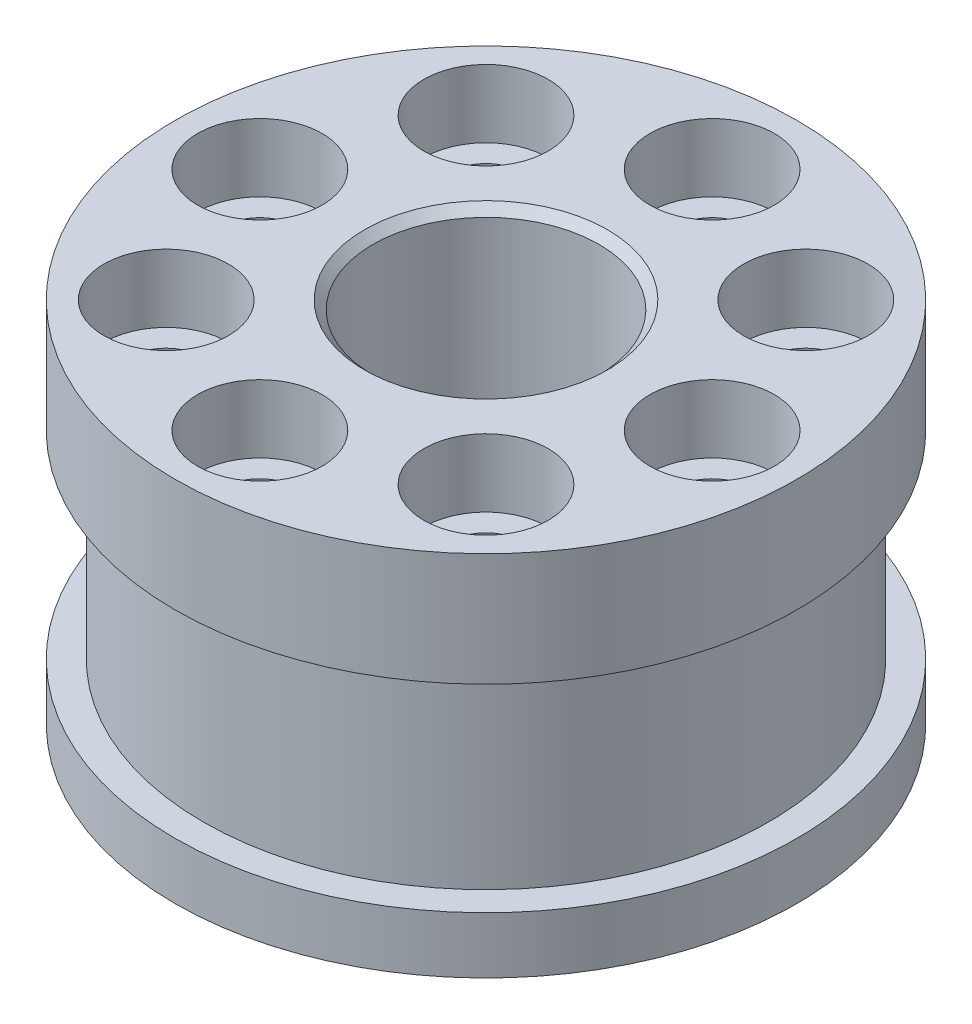
ISO-10303-21;
HEADER;
FILE_DESCRIPTION(('STEP AP214'),'2;1');
FILE_NAME('part.step','',(''),(''),'','','');
FILE_SCHEMA(('AUTOMOTIVE_DESIGN { 1 0 10303 214 1 1 1 1 }'));
ENDSEC;
DATA;
#1=APPLICATION_CONTEXT('core data for automotive mechanical design processes');
#2=APPLICATION_PROTOCOL_DEFINITION('international standard','automotive_design',2000,#1);
#3=PRODUCT_CONTEXT('',#1,'mechanical');
#4=PRODUCT('Part','Part','',(#3));
#5=PRODUCT_RELATED_PRODUCT_CATEGORY('part','',(#4));
#6=PRODUCT_DEFINITION_FORMATION('','',#4);
#7=PRODUCT_DEFINITION_CONTEXT('part definition',#1,'design');
#8=PRODUCT_DEFINITION('design','',#6,#7);
#9=PRODUCT_DEFINITION_SHAPE('','',#8);
#10=(LENGTH_UNIT() NAMED_UNIT(*) SI_UNIT(.MILLI.,.METRE.));
#11=(NAMED_UNIT(*) PLANE_ANGLE_UNIT() SI_UNIT($,.RADIAN.));
#12=(NAMED_UNIT(*) SI_UNIT($,.STERADIAN.) SOLID_ANGLE_UNIT());
#13=UNCERTAINTY_MEASURE_WITH_UNIT(LENGTH_MEASURE(1.E-05),#10,'distance_accuracy_value','');
#14=(GEOMETRIC_REPRESENTATION_CONTEXT(3) GLOBAL_UNCERTAINTY_ASSIGNED_CONTEXT((#13)) GLOBAL_UNIT_ASSIGNED_CONTEXT((#10,
#11,#12)) REPRESENTATION_CONTEXT('',''));
#15=CARTESIAN_POINT('',(0.,0.,0.));
#16=DIRECTION('',(0.,0.,1.));
#17=DIRECTION('',(1.,0.,0.));
#18=AXIS2_PLACEMENT_3D('',#15,#16,#17);
#19=CARTESIAN_POINT('',(0.,13.,0.));
#20=DIRECTION('',(0.,-1.,0.));
#21=DIRECTION('',(0.,0.,-1.));
#22=AXIS2_PLACEMENT_3D('',#19,#20,#21);
#23=CYLINDRICAL_SURFACE('',#22,11.);
#24=CARTESIAN_POINT('',(0.,13.,0.));
#25=DIRECTION('',(0.,1.,0.));
#26=DIRECTION('',(0.,0.,1.));
#27=AXIS2_PLACEMENT_3D('',#24,#25,#26);
#28=CIRCLE('',#27,11.);
#29=CARTESIAN_POINT('',(0.,13.,-11.));
#30=VERTEX_POINT('',#29);
#31=EDGE_CURVE('E10',#30,#30,#28,.T.);
#32=CARTESIAN_POINT('',(0.,9.,0.));
#33=DIRECTION('',(0.,-1.,0.));
#34=DIRECTION('',(0.,0.,-1.));
#35=AXIS2_PLACEMENT_3D('',#32,#33,#34);
#36=CIRCLE('',#35,11.);
#37=CARTESIAN_POINT('',(0.,9.,-11.));
#38=VERTEX_POINT('',#37);
#39=EDGE_CURVE('E186',#38,#38,#36,.T.);
#40=CARTESIAN_POINT('',(0.,13.,-11.));
#41=CARTESIAN_POINT('',(0.,12.9583333333333,-11.));
#42=CARTESIAN_POINT('',(0.,12.9166666666667,-11.));
#43=CARTESIAN_POINT('',(0.,12.8333333333333,-11.));
#44=CARTESIAN_POINT('',(0.,12.7916666666667,-11.));
#45=CARTESIAN_POINT('',(0.,12.7083333333333,-11.));
#46=CARTESIAN_POINT('',(0.,12.6666666666667,-11.));
#47=CARTESIAN_POINT('',(0.,12.5833333333333,-11.));
#48=CARTESIAN_POINT('',(0.,12.5416666666667,-11.));
#49=CARTESIAN_POINT('',(0.,12.4583333333333,-11.));
#50=CARTESIAN_POINT('',(0.,12.4166666666667,-11.));
#51=CARTESIAN_POINT('',(0.,12.3333333333333,-11.));
#52=CARTESIAN_POINT('',(0.,12.2916666666667,-11.));
#53=CARTESIAN_POINT('',(0.,12.2083333333333,-11.));
#54=CARTESIAN_POINT('',(0.,12.1666666666667,-11.));
#55=CARTESIAN_POINT('',(0.,12.0833333333333,-11.));
#56=CARTESIAN_POINT('',(0.,12.0416666666667,-11.));
#57=CARTESIAN_POINT('',(0.,11.9583333333333,-11.));
#58=CARTESIAN_POINT('',(0.,11.9166666666667,-11.));
#59=CARTESIAN_POINT('',(0.,11.8333333333333,-11.));
#60=CARTESIAN_POINT('',(0.,11.7916666666667,-11.));
#61=CARTESIAN_POINT('',(0.,11.7083333333333,-11.));
#62=CARTESIAN_POINT('',(0.,11.6666666666667,-11.));
#63=CARTESIAN_POINT('',(0.,11.5833333333333,-11.));
#64=CARTESIAN_POINT('',(0.,11.5416666666667,-11.));
#65=CARTESIAN_POINT('',(0.,11.4583333333333,-11.));
#66=CARTESIAN_POINT('',(0.,11.4166666666667,-11.));
#67=CARTESIAN_POINT('',(0.,11.3333333333333,-11.));
#68=CARTESIAN_POINT('',(0.,11.2916666666667,-11.));
#69=CARTESIAN_POINT('',(0.,11.2083333333333,-11.));
#70=CARTESIAN_POINT('',(0.,11.1666666666667,-11.));
#71=CARTESIAN_POINT('',(0.,11.0833333333333,-11.));
#72=CARTESIAN_POINT('',(0.,11.0416666666667,-11.));
#73=CARTESIAN_POINT('',(0.,10.9583333333333,-11.));
#74=CARTESIAN_POINT('',(0.,10.9166666666667,-11.));
#75=CARTESIAN_POINT('',(0.,10.8333333333333,-11.));
#76=CARTESIAN_POINT('',(0.,10.7916666666667,-11.));
#77=CARTESIAN_POINT('',(0.,10.7083333333333,-11.));
#78=CARTESIAN_POINT('',(0.,10.6666666666667,-11.));
#79=CARTESIAN_POINT('',(0.,10.5833333333333,-11.));
#80=CARTESIAN_POINT('',(0.,10.5416666666667,-11.));
#81=CARTESIAN_POINT('',(0.,10.4583333333333,-11.));
#82=CARTESIAN_POINT('',(0.,10.4166666666667,-11.));
#83=CARTESIAN_POINT('',(0.,10.3333333333333,-11.));
#84=CARTESIAN_POINT('',(0.,10.2916666666667,-11.));
#85=CARTESIAN_POINT('',(0.,10.2083333333333,-11.));
#86=CARTESIAN_POINT('',(0.,10.1666666666667,-11.));
#87=CARTESIAN_POINT('',(0.,10.0833333333333,-11.));
#88=CARTESIAN_POINT('',(0.,10.0416666666667,-11.));
#89=CARTESIAN_POINT('',(0.,9.95833333333333,-11.));
#90=CARTESIAN_POINT('',(0.,9.91666666666667,-11.));
#91=CARTESIAN_POINT('',(0.,9.83333333333333,-11.));
#92=CARTESIAN_POINT('',(0.,9.79166666666667,-11.));
#93=CARTESIAN_POINT('',(0.,9.70833333333333,-11.));
#94=CARTESIAN_POINT('',(0.,9.66666666666667,-11.));
#95=CARTESIAN_POINT('',(0.,9.58333333333333,-11.));
#96=CARTESIAN_POINT('',(0.,9.54166666666667,-11.));
#97=CARTESIAN_POINT('',(0.,9.45833333333333,-11.));
#98=CARTESIAN_POINT('',(0.,9.41666666666667,-11.));
#99=CARTESIAN_POINT('',(0.,9.33333333333333,-11.));
#100=CARTESIAN_POINT('',(0.,9.29166666666667,-11.));
#101=CARTESIAN_POINT('',(0.,9.20833333333333,-11.));
#102=CARTESIAN_POINT('',(0.,9.16666666666667,-11.));
#103=CARTESIAN_POINT('',(0.,9.08333333333333,-11.));
#104=CARTESIAN_POINT('',(0.,9.04166666666667,-11.));
#105=CARTESIAN_POINT('',(0.,9.,-11.));
#106=B_SPLINE_CURVE_WITH_KNOTS('',3,(#40,#41,#42,#43,#44,#45,#46,#47,#48,#49,#50,#51,#52,#53,
#54,#55,#56,#57,#58,#59,#60,#61,#62,#63,#64,#65,#66,#67,#68,#69,#70,#71,#72,#73,#74,#75,#76,#77,
#78,#79,#80,#81,#82,#83,#84,#85,#86,#87,#88,#89,#90,#91,#92,#93,#94,#95,#96,#97,#98,#99,#100,
#101,#102,#103,#104,#105),.UNSPECIFIED.,.F.,.F.,(4,2,2,2,2,2,2,2,2,2,2,2,2,2,2,2,2,2,2,2,2,2,2,
2,2,2,2,2,2,2,2,2,4),(0.,0.124999999999998,0.249999999999999,0.374999999999999,
0.499999999999999,0.624999999999999,0.749999999999999,0.874999999999999,0.999999999999997,1.125,
1.25,1.375,1.5,1.625,1.75,1.875,2.,2.125,2.25,2.375,2.5,2.625,2.75,2.875,3.,3.125,3.25,3.375,
3.5,3.625,3.75,3.875,4.),.UNSPECIFIED.);
#107=EDGE_CURVE('BSEAM44',#30,#38,#106,.T.);
#108=ORIENTED_EDGE('',*,*,#31,.F.);
#109=ORIENTED_EDGE('',*,*,#39,.F.);
#110=ORIENTED_EDGE('',*,*,#107,.T.);
#111=ORIENTED_EDGE('',*,*,#107,.F.);
#112=EDGE_LOOP('',(#108,#110,#109,#111));
#113=FACE_BOUND('',#112,.T.);
#114=ADVANCED_FACE('F44',(#113),#23,.T.);
#115=CARTESIAN_POINT('',(0.,2.,0.));
#116=DIRECTION('',(0.,-1.,0.));
#117=DIRECTION('',(0.,0.,-1.));
#118=AXIS2_PLACEMENT_3D('',#115,#116,#117);
#119=CIRCLE('',#118,11.);
#120=CARTESIAN_POINT('',(0.,2.,-11.));
#121=VERTEX_POINT('',#120);
#122=EDGE_CURVE('E187',#121,#121,#119,.T.);
#123=CARTESIAN_POINT('',(0.,0.,0.));
#124=DIRECTION('',(0.,1.,0.));
#125=DIRECTION('',(0.,0.,1.));
#126=AXIS2_PLACEMENT_3D('',#123,#124,#125);
#127=CIRCLE('',#126,11.);
#128=CARTESIAN_POINT('',(0.,0.,-11.));
#129=VERTEX_POINT('',#128);
#130=EDGE_CURVE('E48',#129,#129,#127,.T.);
#131=CARTESIAN_POINT('',(0.,2.,-11.));
#132=CARTESIAN_POINT('',(0.,1.97916666666667,-11.));
#133=CARTESIAN_POINT('',(0.,1.95833333333334,-11.));
#134=CARTESIAN_POINT('',(0.,1.91666666666667,-11.));
#135=CARTESIAN_POINT('',(0.,1.89583333333334,-11.));
#136=CARTESIAN_POINT('',(0.,1.85416666666667,-11.));
#137=CARTESIAN_POINT('',(0.,1.83333333333334,-11.));
#138=CARTESIAN_POINT('',(0.,1.79166666666667,-11.));
#139=CARTESIAN_POINT('',(0.,1.77083333333334,-11.));
#140=CARTESIAN_POINT('',(0.,1.72916666666667,-11.));
#141=CARTESIAN_POINT('',(0.,1.70833333333333,-11.));
#142=CARTESIAN_POINT('',(0.,1.66666666666667,-11.));
#143=CARTESIAN_POINT('',(0.,1.64583333333333,-11.));
#144=CARTESIAN_POINT('',(0.,1.60416666666667,-11.));
#145=CARTESIAN_POINT('',(0.,1.58333333333333,-11.));
#146=CARTESIAN_POINT('',(0.,1.54166666666667,-11.));
#147=CARTESIAN_POINT('',(0.,1.52083333333333,-11.));
#148=CARTESIAN_POINT('',(0.,1.47916666666667,-11.));
#149=CARTESIAN_POINT('',(0.,1.45833333333333,-11.));
#150=CARTESIAN_POINT('',(0.,1.41666666666667,-11.));
#151=CARTESIAN_POINT('',(0.,1.39583333333333,-11.));
#152=CARTESIAN_POINT('',(0.,1.35416666666667,-11.));
#153=CARTESIAN_POINT('',(0.,1.33333333333333,-11.));
#154=CARTESIAN_POINT('',(0.,1.29166666666667,-11.));
#155=CARTESIAN_POINT('',(0.,1.27083333333333,-11.));
#156=CARTESIAN_POINT('',(0.,1.22916666666667,-11.));
#157=CARTESIAN_POINT('',(0.,1.20833333333333,-11.));
#158=CARTESIAN_POINT('',(0.,1.16666666666667,-11.));
#159=CARTESIAN_POINT('',(0.,1.14583333333333,-11.));
#160=CARTESIAN_POINT('',(0.,1.10416666666667,-11.));
#161=CARTESIAN_POINT('',(0.,1.08333333333333,-11.));
#162=CARTESIAN_POINT('',(0.,1.04166666666667,-11.));
#163=CARTESIAN_POINT('',(0.,1.02083333333333,-11.));
#164=CARTESIAN_POINT('',(0.,0.979166666666668,-11.));
#165=CARTESIAN_POINT('',(0.,0.958333333333334,-11.));
#166=CARTESIAN_POINT('',(0.,0.916666666666668,-11.));
#167=CARTESIAN_POINT('',(0.,0.895833333333334,-11.));
#168=CARTESIAN_POINT('',(0.,0.854166666666667,-11.));
#169=CARTESIAN_POINT('',(0.,0.833333333333334,-11.));
#170=CARTESIAN_POINT('',(0.,0.791666666666667,-11.));
#171=CARTESIAN_POINT('',(0.,0.770833333333334,-11.));
#172=CARTESIAN_POINT('',(0.,0.729166666666667,-11.));
#173=CARTESIAN_POINT('',(0.,0.708333333333334,-11.));
#174=CARTESIAN_POINT('',(0.,0.666666666666667,-11.));
#175=CARTESIAN_POINT('',(0.,0.645833333333334,-11.));
#176=CARTESIAN_POINT('',(0.,0.604166666666667,-11.));
#177=CARTESIAN_POINT('',(0.,0.583333333333334,-11.));
#178=CARTESIAN_POINT('',(0.,0.541666666666667,-11.));
#179=CARTESIAN_POINT('',(0.,0.520833333333334,-11.));
#180=CARTESIAN_POINT('',(0.,0.479166666666667,-11.));
#181=CARTESIAN_POINT('',(0.,0.458333333333334,-11.));
#182=CARTESIAN_POINT('',(0.,0.416666666666667,-11.));
#183=CARTESIAN_POINT('',(0.,0.395833333333334,-11.));
#184=CARTESIAN_POINT('',(0.,0.354166666666667,-11.));
#185=CARTESIAN_POINT('',(0.,0.333333333333334,-11.));
#186=CARTESIAN_POINT('',(0.,0.291666666666667,-11.));
#187=CARTESIAN_POINT('',(0.,0.270833333333334,-11.));
#188=CARTESIAN_POINT('',(0.,0.229166666666667,-11.));
#189=CARTESIAN_POINT('',(0.,0.208333333333334,-11.));
#190=CARTESIAN_POINT('',(0.,0.166666666666667,-11.));
#191=CARTESIAN_POINT('',(0.,0.145833333333333,-11.));
#192=CARTESIAN_POINT('',(0.,0.104166666666667,-11.));
#193=CARTESIAN_POINT('',(0.,0.0833333333333334,-11.));
#194=CARTESIAN_POINT('',(0.,0.0416666666666667,-11.));
#195=CARTESIAN_POINT('',(0.,0.0208333333333333,-11.));
#196=CARTESIAN_POINT('',(0.,0.,-11.));
#197=B_SPLINE_CURVE_WITH_KNOTS('',3,(#131,#132,#133,#134,#135,#136,#137,#138,#139,#140,#141,
#142,#143,#144,#145,#146,#147,#148,#149,#150,#151,#152,#153,#154,#155,#156,#157,#158,#159,#160,
#161,#162,#163,#164,#165,#166,#167,#168,#169,#170,#171,#172,#173,#174,#175,#176,#177,#178,#179,
#180,#181,#182,#183,#184,#185,#186,#187,#188,#189,#190,#191,#192,#193,#194,#195,#196),
.UNSPECIFIED.,.F.,.F.,(4,2,2,2,2,2,2,2,2,2,2,2,2,2,2,2,2,2,2,2,2,2,2,2,2,2,2,2,2,2,2,2,4),(0.,
0.0625000000000001,0.125,0.1875,0.25,0.3125,0.375,0.4375,0.5,0.5625,0.625000000000001,
0.687500000000001,0.750000000000001,0.812500000000001,0.875000000000001,0.937500000000001,1.,
1.0625,1.125,1.1875,1.25,1.3125,1.375,1.4375,1.5,1.5625,1.625,1.6875,1.75,1.8125,1.875,1.9375,
2.),.UNSPECIFIED.);
#198=EDGE_CURVE('BSEAM46',#121,#129,#197,.T.);
#199=ORIENTED_EDGE('',*,*,#122,.T.);
#200=ORIENTED_EDGE('',*,*,#130,.T.);
#201=ORIENTED_EDGE('',*,*,#198,.T.);
#202=ORIENTED_EDGE('',*,*,#198,.F.);
#203=EDGE_LOOP('',(#199,#201,#200,#202));
#204=FACE_BOUND('',#203,.T.);
#205=ADVANCED_FACE('F46',(#204),#23,.T.);
#206=CARTESIAN_POINT('',(0.,13.,0.));
#207=DIRECTION('',(0.,1.,0.));
#208=DIRECTION('',(0.,0.,1.));
#209=AXIS2_PLACEMENT_3D('',#206,#207,#208);
#210=PLANE('',#209);
#211=CARTESIAN_POINT('',(0.,13.,0.));
#212=DIRECTION('',(0.,-1.,0.));
#213=DIRECTION('',(0.,0.,-1.));
#214=AXIS2_PLACEMENT_3D('',#211,#212,#213);
#215=CIRCLE('',#214,4.3);
#216=CARTESIAN_POINT('',(0.,13.,-4.3));
#217=VERTEX_POINT('',#216);
#218=EDGE_CURVE('E214',#217,#217,#215,.T.);
#219=ORIENTED_EDGE('',*,*,#218,.T.);
#220=EDGE_LOOP('',(#219));
#221=FACE_BOUND('',#220,.T.);
#222=CARTESIAN_POINT('',(0.,13.,-8.));
#223=DIRECTION('',(0.,1.,0.));
#224=DIRECTION('',(0.,0.,1.));
#225=AXIS2_PLACEMENT_3D('',#222,#223,#224);
#226=CIRCLE('',#225,2.2);
#227=CARTESIAN_POINT('',(0.,13.,-5.8));
#228=VERTEX_POINT('',#227);
#229=EDGE_CURVE('E182',#228,#228,#226,.T.);
#230=ORIENTED_EDGE('',*,*,#229,.F.);
#231=EDGE_LOOP('',(#230));
#232=FACE_BOUND('',#231,.T.);
#233=CARTESIAN_POINT('',(5.65685424949248,13.,-5.65685424949262));
#234=DIRECTION('',(0.,1.,0.));
#235=DIRECTION('',(0.,0.,1.));
#236=AXIS2_PLACEMENT_3D('',#233,#234,#235);
#237=CIRCLE('',#236,2.2);
#238=CARTESIAN_POINT('',(5.65685424949248,13.,-3.45685424949262));
#239=VERTEX_POINT('',#238);
#240=EDGE_CURVE('E166',#239,#239,#237,.T.);
#241=ORIENTED_EDGE('',*,*,#240,.F.);
#242=EDGE_LOOP('',(#241));
#243=FACE_BOUND('',#242,.T.);
#244=CARTESIAN_POINT('',(8.00000000000034,13.,-3.39590937005871E-13));
#245=DIRECTION('',(0.,1.,0.));
#246=DIRECTION('',(0.,0.,1.));
#247=AXIS2_PLACEMENT_3D('',#244,#245,#246);
#248=CIRCLE('',#247,2.2);
#249=CARTESIAN_POINT('',(8.00000000000034,13.,2.19999999999966));
#250=VERTEX_POINT('',#249);
#251=EDGE_CURVE('E150',#250,#250,#248,.T.);
#252=ORIENTED_EDGE('',*,*,#251,.F.);
#253=EDGE_LOOP('',(#252));
#254=FACE_BOUND('',#253,.T.);
#255=CARTESIAN_POINT('',(5.65685424949296,13.,5.65685424949214));
#256=DIRECTION('',(0.,1.,0.));
#257=DIRECTION('',(0.,0.,1.));
#258=AXIS2_PLACEMENT_3D('',#255,#256,#257);
#259=CIRCLE('',#258,2.2);
#260=CARTESIAN_POINT('',(5.65685424949296,13.,7.85685424949214));
#261=VERTEX_POINT('',#260);
#262=EDGE_CURVE('E134',#261,#261,#259,.T.);
#263=ORIENTED_EDGE('',*,*,#262,.F.);
#264=EDGE_LOOP('',(#263));
#265=FACE_BOUND('',#264,.T.);
#266=CARTESIAN_POINT('',(6.79181874011742E-13,13.,8.));
#267=DIRECTION('',(0.,1.,0.));
#268=DIRECTION('',(0.,0.,1.));
#269=AXIS2_PLACEMENT_3D('',#266,#267,#268);
#270=CIRCLE('',#269,2.2);
#271=CARTESIAN_POINT('',(6.79181874011742E-13,13.,10.2));
#272=VERTEX_POINT('',#271);
#273=EDGE_CURVE('E118',#272,#272,#270,.T.);
#274=ORIENTED_EDGE('',*,*,#273,.F.);
#275=EDGE_LOOP('',(#274));
#276=FACE_BOUND('',#275,.T.);
#277=CARTESIAN_POINT('',(-5.6568542494918,13.,5.65685424949262));
#278=DIRECTION('',(0.,1.,0.));
#279=DIRECTION('',(0.,0.,1.));
#280=AXIS2_PLACEMENT_3D('',#277,#278,#279);
#281=CIRCLE('',#280,2.2);
#282=CARTESIAN_POINT('',(-5.6568542494918,13.,7.85685424949262));
#283=VERTEX_POINT('',#282);
#284=EDGE_CURVE('E102',#283,#283,#281,.T.);
#285=ORIENTED_EDGE('',*,*,#284,.F.);
#286=EDGE_LOOP('',(#285));
#287=FACE_BOUND('',#286,.T.);
#288=CARTESIAN_POINT('',(-7.99999999999966,13.,3.40570654445189E-13));
#289=DIRECTION('',(0.,1.,0.));
#290=DIRECTION('',(0.,0.,1.));
#291=AXIS2_PLACEMENT_3D('',#288,#289,#290);
#292=CIRCLE('',#291,2.2);
#293=CARTESIAN_POINT('',(-7.99999999999966,13.,2.20000000000034));
#294=VERTEX_POINT('',#293);
#295=EDGE_CURVE('E86',#294,#294,#292,.T.);
#296=ORIENTED_EDGE('',*,*,#295,.F.);
#297=EDGE_LOOP('',(#296));
#298=FACE_BOUND('',#297,.T.);
#299=CARTESIAN_POINT('',(-5.65685424949228,13.,-5.65685424949214));
#300=DIRECTION('',(0.,1.,0.));
#301=DIRECTION('',(0.,0.,1.));
#302=AXIS2_PLACEMENT_3D('',#299,#300,#301);
#303=CIRCLE('',#302,2.2);
#304=CARTESIAN_POINT('',(-5.65685424949228,13.,-3.45685424949214));
#305=VERTEX_POINT('',#304);
#306=EDGE_CURVE('E70',#305,#305,#303,.T.);
#307=ORIENTED_EDGE('',*,*,#306,.F.);
#308=EDGE_LOOP('',(#307));
#309=FACE_BOUND('',#308,.T.);
#310=ORIENTED_EDGE('',*,*,#31,.T.);
#311=EDGE_LOOP('',(#310));
#312=FACE_BOUND('',#311,.T.);
#313=ADVANCED_FACE('F219',(#221,#232,#243,#254,#265,#276,#287,#298,#309,#312),#210,.T.);
#314=CARTESIAN_POINT('',(0.,0.,0.));
#315=DIRECTION('',(0.,1.,0.));
#316=DIRECTION('',(0.,0.,1.));
#317=AXIS2_PLACEMENT_3D('',#314,#315,#316);
#318=PLANE('',#317);
#319=CARTESIAN_POINT('',(0.,0.,0.));
#320=DIRECTION('',(0.,-1.,0.));
#321=DIRECTION('',(0.,0.,-1.));
#322=AXIS2_PLACEMENT_3D('',#319,#320,#321);
#323=CIRCLE('',#322,4.3);
#324=CARTESIAN_POINT('',(0.,0.,-4.3));
#325=VERTEX_POINT('',#324);
#326=EDGE_CURVE('E210',#325,#325,#323,.T.);
#327=ORIENTED_EDGE('',*,*,#326,.F.);
#328=EDGE_LOOP('',(#327));
#329=FACE_BOUND('',#328,.T.);
#330=CARTESIAN_POINT('',(0.,0.,-8.));
#331=DIRECTION('',(0.,1.,0.));
#332=DIRECTION('',(0.,0.,1.));
#333=AXIS2_PLACEMENT_3D('',#330,#331,#332);
#334=CIRCLE('',#333,1.3);
#335=CARTESIAN_POINT('',(0.,0.,-6.7));
#336=VERTEX_POINT('',#335);
#337=EDGE_CURVE('E170',#336,#336,#334,.T.);
#338=ORIENTED_EDGE('',*,*,#337,.T.);
#339=EDGE_LOOP('',(#338));
#340=FACE_BOUND('',#339,.T.);
#341=CARTESIAN_POINT('',(5.65685424949248,0.,-5.65685424949262));
#342=DIRECTION('',(0.,1.,0.));
#343=DIRECTION('',(0.,0.,1.));
#344=AXIS2_PLACEMENT_3D('',#341,#342,#343);
#345=CIRCLE('',#344,1.3);
#346=CARTESIAN_POINT('',(5.65685424949248,0.,-4.35685424949262));
#347=VERTEX_POINT('',#346);
#348=EDGE_CURVE('E154',#347,#347,#345,.T.);
#349=ORIENTED_EDGE('',*,*,#348,.T.);
#350=EDGE_LOOP('',(#349));
#351=FACE_BOUND('',#350,.T.);
#352=CARTESIAN_POINT('',(8.00000000000034,0.,-3.39590937005871E-13));
#353=DIRECTION('',(0.,1.,0.));
#354=DIRECTION('',(0.,0.,1.));
#355=AXIS2_PLACEMENT_3D('',#352,#353,#354);
#356=CIRCLE('',#355,1.3);
#357=CARTESIAN_POINT('',(8.00000000000034,0.,1.29999999999966));
#358=VERTEX_POINT('',#357);
#359=EDGE_CURVE('E138',#358,#358,#356,.T.);
#360=ORIENTED_EDGE('',*,*,#359,.T.);
#361=EDGE_LOOP('',(#360));
#362=FACE_BOUND('',#361,.T.);
#363=CARTESIAN_POINT('',(5.65685424949296,0.,5.65685424949214));
#364=DIRECTION('',(0.,1.,0.));
#365=DIRECTION('',(0.,0.,1.));
#366=AXIS2_PLACEMENT_3D('',#363,#364,#365);
#367=CIRCLE('',#366,1.3);
#368=CARTESIAN_POINT('',(5.65685424949296,0.,6.95685424949214));
#369=VERTEX_POINT('',#368);
#370=EDGE_CURVE('E122',#369,#369,#367,.T.);
#371=ORIENTED_EDGE('',*,*,#370,.T.);
#372=EDGE_LOOP('',(#371));
#373=FACE_BOUND('',#372,.T.);
#374=CARTESIAN_POINT('',(6.79181874011742E-13,0.,8.));
#375=DIRECTION('',(0.,1.,0.));
#376=DIRECTION('',(0.,0.,1.));
#377=AXIS2_PLACEMENT_3D('',#374,#375,#376);
#378=CIRCLE('',#377,1.3);
#379=CARTESIAN_POINT('',(6.79181874011742E-13,0.,9.3));
#380=VERTEX_POINT('',#379);
#381=EDGE_CURVE('E106',#380,#380,#378,.T.);
#382=ORIENTED_EDGE('',*,*,#381,.T.);
#383=EDGE_LOOP('',(#382));
#384=FACE_BOUND('',#383,.T.);
#385=CARTESIAN_POINT('',(-5.6568542494918,0.,5.65685424949262));
#386=DIRECTION('',(0.,1.,0.));
#387=DIRECTION('',(0.,0.,1.));
#388=AXIS2_PLACEMENT_3D('',#385,#386,#387);
#389=CIRCLE('',#388,1.3);
#390=CARTESIAN_POINT('',(-5.6568542494918,0.,6.95685424949262));
#391=VERTEX_POINT('',#390);
#392=EDGE_CURVE('E90',#391,#391,#389,.T.);
#393=ORIENTED_EDGE('',*,*,#392,.T.);
#394=EDGE_LOOP('',(#393));
#395=FACE_BOUND('',#394,.T.);
#396=CARTESIAN_POINT('',(-7.99999999999966,0.,3.40570654445189E-13));
#397=DIRECTION('',(0.,1.,0.));
#398=DIRECTION('',(0.,0.,1.));
#399=AXIS2_PLACEMENT_3D('',#396,#397,#398);
#400=CIRCLE('',#399,1.3);
#401=CARTESIAN_POINT('',(-7.99999999999966,0.,1.30000000000034));
#402=VERTEX_POINT('',#401);
#403=EDGE_CURVE('E74',#402,#402,#400,.T.);
#404=ORIENTED_EDGE('',*,*,#403,.T.);
#405=EDGE_LOOP('',(#404));
#406=FACE_BOUND('',#405,.T.);
#407=CARTESIAN_POINT('',(-5.65685424949228,0.,-5.65685424949214));
#408=DIRECTION('',(0.,1.,0.));
#409=DIRECTION('',(0.,0.,1.));
#410=AXIS2_PLACEMENT_3D('',#407,#408,#409);
#411=CIRCLE('',#410,1.3);
#412=CARTESIAN_POINT('',(-5.65685424949228,0.,-4.35685424949214));
#413=VERTEX_POINT('',#412);
#414=EDGE_CURVE('E57',#413,#413,#411,.T.);
#415=ORIENTED_EDGE('',*,*,#414,.T.);
#416=EDGE_LOOP('',(#415));
#417=FACE_BOUND('',#416,.T.);
#418=ORIENTED_EDGE('',*,*,#130,.F.);
#419=EDGE_LOOP('',(#418));
#420=FACE_BOUND('',#419,.T.);
#421=ADVANCED_FACE('F241',(#329,#340,#351,#362,#373,#384,#395,#406,#417,#420),#318,.F.);
#422=CARTESIAN_POINT('',(-5.65685424949228,13.,-5.65685424949214));
#423=DIRECTION('',(0.,1.,0.));
#424=DIRECTION('',(0.,0.,1.));
#425=AXIS2_PLACEMENT_3D('',#422,#423,#424);
#426=CYLINDRICAL_SURFACE('',#425,1.3);
#427=ORIENTED_EDGE('',*,*,#414,.F.);
#428=EDGE_LOOP('',(#427));
#429=FACE_BOUND('',#428,.T.);
#430=CARTESIAN_POINT('',(-5.65685424949228,10.6,-5.65685424949214));
#431=DIRECTION('',(0.,1.,0.));
#432=DIRECTION('',(0.,0.,1.));
#433=AXIS2_PLACEMENT_3D('',#430,#431,#432);
#434=CIRCLE('',#433,1.3);
#435=CARTESIAN_POINT('',(-5.65685424949228,10.6,-4.35685424949214));
#436=VERTEX_POINT('',#435);
#437=EDGE_CURVE('E62',#436,#436,#434,.T.);
#438=ORIENTED_EDGE('',*,*,#437,.T.);
#439=EDGE_LOOP('',(#438));
#440=FACE_BOUND('',#439,.T.);
#441=ADVANCED_FACE('F244',(#429,#440),#426,.F.);
#442=CARTESIAN_POINT('',(-4.35685424949228,10.6,-5.65685424949214));
#443=DIRECTION('',(0.,-1.,0.));
#444=DIRECTION('',(0.,0.,-1.));
#445=AXIS2_PLACEMENT_3D('',#442,#443,#444);
#446=PLANE('',#445);
#447=ORIENTED_EDGE('',*,*,#437,.F.);
#448=EDGE_LOOP('',(#447));
#449=FACE_BOUND('',#448,.T.);
#450=CARTESIAN_POINT('',(-5.65685424949228,10.6,-5.65685424949214));
#451=DIRECTION('',(0.,1.,0.));
#452=DIRECTION('',(0.,0.,1.));
#453=AXIS2_PLACEMENT_3D('',#450,#451,#452);
#454=CIRCLE('',#453,2.2);
#455=CARTESIAN_POINT('',(-5.65685424949228,10.6,-3.45685424949214));
#456=VERTEX_POINT('',#455);
#457=EDGE_CURVE('E66',#456,#456,#454,.T.);
#458=ORIENTED_EDGE('',*,*,#457,.T.);
#459=EDGE_LOOP('',(#458));
#460=FACE_BOUND('',#459,.T.);
#461=ADVANCED_FACE('F375',(#449,#460),#446,.F.);
#462=CARTESIAN_POINT('',(-5.65685424949228,13.,-5.65685424949214));
#463=DIRECTION('',(0.,1.,0.));
#464=DIRECTION('',(0.,0.,1.));
#465=AXIS2_PLACEMENT_3D('',#462,#463,#464);
#466=CYLINDRICAL_SURFACE('',#465,2.2);
#467=ORIENTED_EDGE('',*,*,#457,.F.);
#468=EDGE_LOOP('',(#467));
#469=FACE_BOUND('',#468,.T.);
#470=ORIENTED_EDGE('',*,*,#306,.T.);
#471=EDGE_LOOP('',(#470));
#472=FACE_BOUND('',#471,.T.);
#473=ADVANCED_FACE('F371',(#469,#472),#466,.F.);
#474=CARTESIAN_POINT('',(-7.99999999999966,13.,3.40570654445189E-13));
#475=DIRECTION('',(0.,1.,0.));
#476=DIRECTION('',(0.,0.,1.));
#477=AXIS2_PLACEMENT_3D('',#474,#475,#476);
#478=CYLINDRICAL_SURFACE('',#477,1.3);
#479=ORIENTED_EDGE('',*,*,#403,.F.);
#480=EDGE_LOOP('',(#479));
#481=FACE_BOUND('',#480,.T.);
#482=CARTESIAN_POINT('',(-7.99999999999966,10.6,3.40570654445189E-13));
#483=DIRECTION('',(0.,1.,0.));
#484=DIRECTION('',(0.,0.,1.));
#485=AXIS2_PLACEMENT_3D('',#482,#483,#484);
#486=CIRCLE('',#485,1.3);
#487=CARTESIAN_POINT('',(-7.99999999999966,10.6,1.30000000000034));
#488=VERTEX_POINT('',#487);
#489=EDGE_CURVE('E78',#488,#488,#486,.T.);
#490=ORIENTED_EDGE('',*,*,#489,.T.);
#491=EDGE_LOOP('',(#490));
#492=FACE_BOUND('',#491,.T.);
#493=ADVANCED_FACE('F367',(#481,#492),#478,.F.);
#494=CARTESIAN_POINT('',(-6.69999999999966,10.6,3.40570654445189E-13));
#495=DIRECTION('',(0.,-1.,0.));
#496=DIRECTION('',(0.,0.,-1.));
#497=AXIS2_PLACEMENT_3D('',#494,#495,#496);
#498=PLANE('',#497);
#499=ORIENTED_EDGE('',*,*,#489,.F.);
#500=EDGE_LOOP('',(#499));
#501=FACE_BOUND('',#500,.T.);
#502=CARTESIAN_POINT('',(-7.99999999999966,10.6,3.40570654445189E-13));
#503=DIRECTION('',(0.,1.,0.));
#504=DIRECTION('',(0.,0.,1.));
#505=AXIS2_PLACEMENT_3D('',#502,#503,#504);
#506=CIRCLE('',#505,2.2);
#507=CARTESIAN_POINT('',(-7.99999999999966,10.6,2.20000000000034));
#508=VERTEX_POINT('',#507);
#509=EDGE_CURVE('E82',#508,#508,#506,.T.);
#510=ORIENTED_EDGE('',*,*,#509,.T.);
#511=EDGE_LOOP('',(#510));
#512=FACE_BOUND('',#511,.T.);
#513=ADVANCED_FACE('F363',(#501,#512),#498,.F.);
#514=CARTESIAN_POINT('',(-7.99999999999966,13.,3.40570654445189E-13));
#515=DIRECTION('',(0.,1.,0.));
#516=DIRECTION('',(0.,0.,1.));
#517=AXIS2_PLACEMENT_3D('',#514,#515,#516);
#518=CYLINDRICAL_SURFACE('',#517,2.2);
#519=ORIENTED_EDGE('',*,*,#509,.F.);
#520=EDGE_LOOP('',(#519));
#521=FACE_BOUND('',#520,.T.);
#522=ORIENTED_EDGE('',*,*,#295,.T.);
#523=EDGE_LOOP('',(#522));
#524=FACE_BOUND('',#523,.T.);
#525=ADVANCED_FACE('F359',(#521,#524),#518,.F.);
#526=CARTESIAN_POINT('',(-5.6568542494918,13.,5.65685424949262));
#527=DIRECTION('',(0.,1.,0.));
#528=DIRECTION('',(0.,0.,1.));
#529=AXIS2_PLACEMENT_3D('',#526,#527,#528);
#530=CYLINDRICAL_SURFACE('',#529,1.3);
#531=ORIENTED_EDGE('',*,*,#392,.F.);
#532=EDGE_LOOP('',(#531));
#533=FACE_BOUND('',#532,.T.);
#534=CARTESIAN_POINT('',(-5.6568542494918,10.6,5.65685424949262));
#535=DIRECTION('',(0.,1.,0.));
#536=DIRECTION('',(0.,0.,1.));
#537=AXIS2_PLACEMENT_3D('',#534,#535,#536);
#538=CIRCLE('',#537,1.3);
#539=CARTESIAN_POINT('',(-5.6568542494918,10.6,6.95685424949262));
#540=VERTEX_POINT('',#539);
#541=EDGE_CURVE('E94',#540,#540,#538,.T.);
#542=ORIENTED_EDGE('',*,*,#541,.T.);
#543=EDGE_LOOP('',(#542));
#544=FACE_BOUND('',#543,.T.);
#545=ADVANCED_FACE('F355',(#533,#544),#530,.F.);
#546=CARTESIAN_POINT('',(-4.3568542494918,10.6,5.65685424949262));
#547=DIRECTION('',(0.,-1.,0.));
#548=DIRECTION('',(0.,0.,-1.));
#549=AXIS2_PLACEMENT_3D('',#546,#547,#548);
#550=PLANE('',#549);
#551=ORIENTED_EDGE('',*,*,#541,.F.);
#552=EDGE_LOOP('',(#551));
#553=FACE_BOUND('',#552,.T.);
#554=CARTESIAN_POINT('',(-5.6568542494918,10.6,5.65685424949262));
#555=DIRECTION('',(0.,1.,0.));
#556=DIRECTION('',(0.,0.,1.));
#557=AXIS2_PLACEMENT_3D('',#554,#555,#556);
#558=CIRCLE('',#557,2.2);
#559=CARTESIAN_POINT('',(-5.6568542494918,10.6,7.85685424949262));
#560=VERTEX_POINT('',#559);
#561=EDGE_CURVE('E98',#560,#560,#558,.T.);
#562=ORIENTED_EDGE('',*,*,#561,.T.);
#563=EDGE_LOOP('',(#562));
#564=FACE_BOUND('',#563,.T.);
#565=ADVANCED_FACE('F351',(#553,#564),#550,.F.);
#566=CARTESIAN_POINT('',(-5.6568542494918,13.,5.65685424949262));
#567=DIRECTION('',(0.,1.,0.));
#568=DIRECTION('',(0.,0.,1.));
#569=AXIS2_PLACEMENT_3D('',#566,#567,#568);
#570=CYLINDRICAL_SURFACE('',#569,2.2);
#571=ORIENTED_EDGE('',*,*,#561,.F.);
#572=EDGE_LOOP('',(#571));
#573=FACE_BOUND('',#572,.T.);
#574=ORIENTED_EDGE('',*,*,#284,.T.);
#575=EDGE_LOOP('',(#574));
#576=FACE_BOUND('',#575,.T.);
#577=ADVANCED_FACE('F347',(#573,#576),#570,.F.);
#578=CARTESIAN_POINT('',(6.79181874011742E-13,13.,8.));
#579=DIRECTION('',(0.,1.,0.));
#580=DIRECTION('',(0.,0.,1.));
#581=AXIS2_PLACEMENT_3D('',#578,#579,#580);
#582=CYLINDRICAL_SURFACE('',#581,1.3);
#583=ORIENTED_EDGE('',*,*,#381,.F.);
#584=EDGE_LOOP('',(#583));
#585=FACE_BOUND('',#584,.T.);
#586=CARTESIAN_POINT('',(6.79181874011742E-13,10.6,8.));
#587=DIRECTION('',(0.,1.,0.));
#588=DIRECTION('',(0.,0.,1.));
#589=AXIS2_PLACEMENT_3D('',#586,#587,#588);
#590=CIRCLE('',#589,1.3);
#591=CARTESIAN_POINT('',(6.79181874011742E-13,10.6,9.3));
#592=VERTEX_POINT('',#591);
#593=EDGE_CURVE('E110',#592,#592,#590,.T.);
#594=ORIENTED_EDGE('',*,*,#593,.T.);
#595=EDGE_LOOP('',(#594));
#596=FACE_BOUND('',#595,.T.);
#597=ADVANCED_FACE('F343',(#585,#596),#582,.F.);
#598=CARTESIAN_POINT('',(1.30000000000068,10.6,8.));
#599=DIRECTION('',(0.,-1.,0.));
#600=DIRECTION('',(0.,0.,-1.));
#601=AXIS2_PLACEMENT_3D('',#598,#599,#600);
#602=PLANE('',#601);
#603=ORIENTED_EDGE('',*,*,#593,.F.);
#604=EDGE_LOOP('',(#603));
#605=FACE_BOUND('',#604,.T.);
#606=CARTESIAN_POINT('',(6.79181874011742E-13,10.6,8.));
#607=DIRECTION('',(0.,1.,0.));
#608=DIRECTION('',(0.,0.,1.));
#609=AXIS2_PLACEMENT_3D('',#606,#607,#608);
#610=CIRCLE('',#609,2.2);
#611=CARTESIAN_POINT('',(6.79181874011742E-13,10.6,10.2));
#612=VERTEX_POINT('',#611);
#613=EDGE_CURVE('E114',#612,#612,#610,.T.);
#614=ORIENTED_EDGE('',*,*,#613,.T.);
#615=EDGE_LOOP('',(#614));
#616=FACE_BOUND('',#615,.T.);
#617=ADVANCED_FACE('F339',(#605,#616),#602,.F.);
#618=CARTESIAN_POINT('',(6.79181874011742E-13,13.,8.));
#619=DIRECTION('',(0.,1.,0.));
#620=DIRECTION('',(0.,0.,1.));
#621=AXIS2_PLACEMENT_3D('',#618,#619,#620);
#622=CYLINDRICAL_SURFACE('',#621,2.2);
#623=ORIENTED_EDGE('',*,*,#613,.F.);
#624=EDGE_LOOP('',(#623));
#625=FACE_BOUND('',#624,.T.);
#626=ORIENTED_EDGE('',*,*,#273,.T.);
#627=EDGE_LOOP('',(#626));
#628=FACE_BOUND('',#627,.T.);
#629=ADVANCED_FACE('F335',(#625,#628),#622,.F.);
#630=CARTESIAN_POINT('',(5.65685424949296,13.,5.65685424949214));
#631=DIRECTION('',(0.,1.,0.));
#632=DIRECTION('',(0.,0.,1.));
#633=AXIS2_PLACEMENT_3D('',#630,#631,#632);
#634=CYLINDRICAL_SURFACE('',#633,1.3);
#635=ORIENTED_EDGE('',*,*,#370,.F.);
#636=EDGE_LOOP('',(#635));
#637=FACE_BOUND('',#636,.T.);
#638=CARTESIAN_POINT('',(5.65685424949296,10.6,5.65685424949214));
#639=DIRECTION('',(0.,1.,0.));
#640=DIRECTION('',(0.,0.,1.));
#641=AXIS2_PLACEMENT_3D('',#638,#639,#640);
#642=CIRCLE('',#641,1.3);
#643=CARTESIAN_POINT('',(5.65685424949296,10.6,6.95685424949214));
#644=VERTEX_POINT('',#643);
#645=EDGE_CURVE('E126',#644,#644,#642,.T.);
#646=ORIENTED_EDGE('',*,*,#645,.T.);
#647=EDGE_LOOP('',(#646));
#648=FACE_BOUND('',#647,.T.);
#649=ADVANCED_FACE('F331',(#637,#648),#634,.F.);
#650=CARTESIAN_POINT('',(6.95685424949296,10.6,5.65685424949214));
#651=DIRECTION('',(0.,-1.,0.));
#652=DIRECTION('',(0.,0.,-1.));
#653=AXIS2_PLACEMENT_3D('',#650,#651,#652);
#654=PLANE('',#653);
#655=ORIENTED_EDGE('',*,*,#645,.F.);
#656=EDGE_LOOP('',(#655));
#657=FACE_BOUND('',#656,.T.);
#658=CARTESIAN_POINT('',(5.65685424949296,10.6,5.65685424949214));
#659=DIRECTION('',(0.,1.,0.));
#660=DIRECTION('',(0.,0.,1.));
#661=AXIS2_PLACEMENT_3D('',#658,#659,#660);
#662=CIRCLE('',#661,2.2);
#663=CARTESIAN_POINT('',(5.65685424949296,10.6,7.85685424949214));
#664=VERTEX_POINT('',#663);
#665=EDGE_CURVE('E130',#664,#664,#662,.T.);
#666=ORIENTED_EDGE('',*,*,#665,.T.);
#667=EDGE_LOOP('',(#666));
#668=FACE_BOUND('',#667,.T.);
#669=ADVANCED_FACE('F327',(#657,#668),#654,.F.);
#670=CARTESIAN_POINT('',(5.65685424949296,13.,5.65685424949214));
#671=DIRECTION('',(0.,1.,0.));
#672=DIRECTION('',(0.,0.,1.));
#673=AXIS2_PLACEMENT_3D('',#670,#671,#672);
#674=CYLINDRICAL_SURFACE('',#673,2.2);
#675=ORIENTED_EDGE('',*,*,#665,.F.);
#676=EDGE_LOOP('',(#675));
#677=FACE_BOUND('',#676,.T.);
#678=ORIENTED_EDGE('',*,*,#262,.T.);
#679=EDGE_LOOP('',(#678));
#680=FACE_BOUND('',#679,.T.);
#681=ADVANCED_FACE('F323',(#677,#680),#674,.F.);
#682=CARTESIAN_POINT('',(8.00000000000034,13.,-3.39590937005871E-13));
#683=DIRECTION('',(0.,1.,0.));
#684=DIRECTION('',(0.,0.,1.));
#685=AXIS2_PLACEMENT_3D('',#682,#683,#684);
#686=CYLINDRICAL_SURFACE('',#685,1.3);
#687=ORIENTED_EDGE('',*,*,#359,.F.);
#688=EDGE_LOOP('',(#687));
#689=FACE_BOUND('',#688,.T.);
#690=CARTESIAN_POINT('',(8.00000000000034,10.6,-3.39590937005871E-13));
#691=DIRECTION('',(0.,1.,0.));
#692=DIRECTION('',(0.,0.,1.));
#693=AXIS2_PLACEMENT_3D('',#690,#691,#692);
#694=CIRCLE('',#693,1.3);
#695=CARTESIAN_POINT('',(8.00000000000034,10.6,1.29999999999966));
#696=VERTEX_POINT('',#695);
#697=EDGE_CURVE('E142',#696,#696,#694,.T.);
#698=ORIENTED_EDGE('',*,*,#697,.T.);
#699=EDGE_LOOP('',(#698));
#700=FACE_BOUND('',#699,.T.);
#701=ADVANCED_FACE('F319',(#689,#700),#686,.F.);
#702=CARTESIAN_POINT('',(9.30000000000034,10.6,-3.39590937005871E-13));
#703=DIRECTION('',(0.,-1.,0.));
#704=DIRECTION('',(0.,0.,-1.));
#705=AXIS2_PLACEMENT_3D('',#702,#703,#704);
#706=PLANE('',#705);
#707=ORIENTED_EDGE('',*,*,#697,.F.);
#708=EDGE_LOOP('',(#707));
#709=FACE_BOUND('',#708,.T.);
#710=CARTESIAN_POINT('',(8.00000000000034,10.6,-3.39590937005871E-13));
#711=DIRECTION('',(0.,1.,0.));
#712=DIRECTION('',(0.,0.,1.));
#713=AXIS2_PLACEMENT_3D('',#710,#711,#712);
#714=CIRCLE('',#713,2.2);
#715=CARTESIAN_POINT('',(8.00000000000034,10.6,2.19999999999966));
#716=VERTEX_POINT('',#715);
#717=EDGE_CURVE('E146',#716,#716,#714,.T.);
#718=ORIENTED_EDGE('',*,*,#717,.T.);
#719=EDGE_LOOP('',(#718));
#720=FACE_BOUND('',#719,.T.);
#721=ADVANCED_FACE('F315',(#709,#720),#706,.F.);
#722=CARTESIAN_POINT('',(8.00000000000034,13.,-3.39590937005871E-13));
#723=DIRECTION('',(0.,1.,0.));
#724=DIRECTION('',(0.,0.,1.));
#725=AXIS2_PLACEMENT_3D('',#722,#723,#724);
#726=CYLINDRICAL_SURFACE('',#725,2.2);
#727=ORIENTED_EDGE('',*,*,#717,.F.);
#728=EDGE_LOOP('',(#727));
#729=FACE_BOUND('',#728,.T.);
#730=ORIENTED_EDGE('',*,*,#251,.T.);
#731=EDGE_LOOP('',(#730));
#732=FACE_BOUND('',#731,.T.);
#733=ADVANCED_FACE('F311',(#729,#732),#726,.F.);
#734=CARTESIAN_POINT('',(5.65685424949248,13.,-5.65685424949262));
#735=DIRECTION('',(0.,1.,0.));
#736=DIRECTION('',(0.,0.,1.));
#737=AXIS2_PLACEMENT_3D('',#734,#735,#736);
#738=CYLINDRICAL_SURFACE('',#737,1.3);
#739=ORIENTED_EDGE('',*,*,#348,.F.);
#740=EDGE_LOOP('',(#739));
#741=FACE_BOUND('',#740,.T.);
#742=CARTESIAN_POINT('',(5.65685424949248,10.6,-5.65685424949262));
#743=DIRECTION('',(0.,1.,0.));
#744=DIRECTION('',(0.,0.,1.));
#745=AXIS2_PLACEMENT_3D('',#742,#743,#744);
#746=CIRCLE('',#745,1.3);
#747=CARTESIAN_POINT('',(5.65685424949248,10.6,-4.35685424949262));
#748=VERTEX_POINT('',#747);
#749=EDGE_CURVE('E158',#748,#748,#746,.T.);
#750=ORIENTED_EDGE('',*,*,#749,.T.);
#751=EDGE_LOOP('',(#750));
#752=FACE_BOUND('',#751,.T.);
#753=ADVANCED_FACE('F307',(#741,#752),#738,.F.);
#754=CARTESIAN_POINT('',(6.95685424949248,10.6,-5.65685424949262));
#755=DIRECTION('',(0.,-1.,0.));
#756=DIRECTION('',(0.,0.,-1.));
#757=AXIS2_PLACEMENT_3D('',#754,#755,#756);
#758=PLANE('',#757);
#759=ORIENTED_EDGE('',*,*,#749,.F.);
#760=EDGE_LOOP('',(#759));
#761=FACE_BOUND('',#760,.T.);
#762=CARTESIAN_POINT('',(5.65685424949248,10.6,-5.65685424949262));
#763=DIRECTION('',(0.,1.,0.));
#764=DIRECTION('',(0.,0.,1.));
#765=AXIS2_PLACEMENT_3D('',#762,#763,#764);
#766=CIRCLE('',#765,2.2);
#767=CARTESIAN_POINT('',(5.65685424949248,10.6,-3.45685424949262));
#768=VERTEX_POINT('',#767);
#769=EDGE_CURVE('E162',#768,#768,#766,.T.);
#770=ORIENTED_EDGE('',*,*,#769,.T.);
#771=EDGE_LOOP('',(#770));
#772=FACE_BOUND('',#771,.T.);
#773=ADVANCED_FACE('F303',(#761,#772),#758,.F.);
#774=CARTESIAN_POINT('',(5.65685424949248,13.,-5.65685424949262));
#775=DIRECTION('',(0.,1.,0.));
#776=DIRECTION('',(0.,0.,1.));
#777=AXIS2_PLACEMENT_3D('',#774,#775,#776);
#778=CYLINDRICAL_SURFACE('',#777,2.2);
#779=ORIENTED_EDGE('',*,*,#769,.F.);
#780=EDGE_LOOP('',(#779));
#781=FACE_BOUND('',#780,.T.);
#782=ORIENTED_EDGE('',*,*,#240,.T.);
#783=EDGE_LOOP('',(#782));
#784=FACE_BOUND('',#783,.T.);
#785=ADVANCED_FACE('F299',(#781,#784),#778,.F.);
#786=CARTESIAN_POINT('',(0.,13.,-8.));
#787=DIRECTION('',(0.,1.,0.));
#788=DIRECTION('',(0.,0.,1.));
#789=AXIS2_PLACEMENT_3D('',#786,#787,#788);
#790=CYLINDRICAL_SURFACE('',#789,1.3);
#791=ORIENTED_EDGE('',*,*,#337,.F.);
#792=EDGE_LOOP('',(#791));
#793=FACE_BOUND('',#792,.T.);
#794=CARTESIAN_POINT('',(0.,10.6,-8.));
#795=DIRECTION('',(0.,1.,0.));
#796=DIRECTION('',(0.,0.,1.));
#797=AXIS2_PLACEMENT_3D('',#794,#795,#796);
#798=CIRCLE('',#797,1.3);
#799=CARTESIAN_POINT('',(0.,10.6,-6.7));
#800=VERTEX_POINT('',#799);
#801=EDGE_CURVE('E174',#800,#800,#798,.T.);
#802=ORIENTED_EDGE('',*,*,#801,.T.);
#803=EDGE_LOOP('',(#802));
#804=FACE_BOUND('',#803,.T.);
#805=ADVANCED_FACE('F295',(#793,#804),#790,.F.);
#806=CARTESIAN_POINT('',(1.3,10.6,-8.));
#807=DIRECTION('',(0.,-1.,0.));
#808=DIRECTION('',(0.,0.,-1.));
#809=AXIS2_PLACEMENT_3D('',#806,#807,#808);
#810=PLANE('',#809);
#811=ORIENTED_EDGE('',*,*,#801,.F.);
#812=EDGE_LOOP('',(#811));
#813=FACE_BOUND('',#812,.T.);
#814=CARTESIAN_POINT('',(0.,10.6,-8.));
#815=DIRECTION('',(0.,1.,0.));
#816=DIRECTION('',(0.,0.,1.));
#817=AXIS2_PLACEMENT_3D('',#814,#815,#816);
#818=CIRCLE('',#817,2.2);
#819=CARTESIAN_POINT('',(0.,10.6,-5.8));
#820=VERTEX_POINT('',#819);
#821=EDGE_CURVE('E178',#820,#820,#818,.T.);
#822=ORIENTED_EDGE('',*,*,#821,.T.);
#823=EDGE_LOOP('',(#822));
#824=FACE_BOUND('',#823,.T.);
#825=ADVANCED_FACE('F291',(#813,#824),#810,.F.);
#826=CARTESIAN_POINT('',(0.,13.,-8.));
#827=DIRECTION('',(0.,1.,0.));
#828=DIRECTION('',(0.,0.,1.));
#829=AXIS2_PLACEMENT_3D('',#826,#827,#828);
#830=CYLINDRICAL_SURFACE('',#829,2.2);
#831=ORIENTED_EDGE('',*,*,#821,.F.);
#832=EDGE_LOOP('',(#831));
#833=FACE_BOUND('',#832,.T.);
#834=ORIENTED_EDGE('',*,*,#229,.T.);
#835=EDGE_LOOP('',(#834));
#836=FACE_BOUND('',#835,.T.);
#837=ADVANCED_FACE('F285',(#833,#836),#830,.F.);
#838=CARTESIAN_POINT('',(0.,9.,0.));
#839=DIRECTION('',(0.,-1.,0.));
#840=DIRECTION('',(0.,0.,-1.));
#841=AXIS2_PLACEMENT_3D('',#838,#839,#840);
#842=PLANE('',#841);
#843=CARTESIAN_POINT('',(0.,9.,0.));
#844=DIRECTION('',(0.,-1.,0.));
#845=DIRECTION('',(0.,0.,-1.));
#846=AXIS2_PLACEMENT_3D('',#843,#844,#845);
#847=CIRCLE('',#846,10.);
#848=CARTESIAN_POINT('',(0.,9.,-10.));
#849=VERTEX_POINT('',#848);
#850=EDGE_CURVE('E191',#849,#849,#847,.T.);
#851=ORIENTED_EDGE('',*,*,#850,.F.);
#852=EDGE_LOOP('',(#851));
#853=FACE_BOUND('',#852,.T.);
#854=ORIENTED_EDGE('',*,*,#39,.T.);
#855=EDGE_LOOP('',(#854));
#856=FACE_BOUND('',#855,.T.);
#857=ADVANCED_FACE('F276',(#853,#856),#842,.T.);
#858=CARTESIAN_POINT('',(0.,2.,0.));
#859=DIRECTION('',(0.,-1.,0.));
#860=DIRECTION('',(0.,0.,-1.));
#861=AXIS2_PLACEMENT_3D('',#858,#859,#860);
#862=PLANE('',#861);
#863=CARTESIAN_POINT('',(0.,2.,0.));
#864=DIRECTION('',(0.,-1.,0.));
#865=DIRECTION('',(0.,0.,-1.));
#866=AXIS2_PLACEMENT_3D('',#863,#864,#865);
#867=CIRCLE('',#866,10.);
#868=CARTESIAN_POINT('',(0.,2.,-10.));
#869=VERTEX_POINT('',#868);
#870=EDGE_CURVE('E195',#869,#869,#867,.T.);
#871=ORIENTED_EDGE('',*,*,#870,.T.);
#872=EDGE_LOOP('',(#871));
#873=FACE_BOUND('',#872,.T.);
#874=ORIENTED_EDGE('',*,*,#122,.F.);
#875=EDGE_LOOP('',(#874));
#876=FACE_BOUND('',#875,.T.);
#877=ADVANCED_FACE('F274',(#873,#876),#862,.F.);
#878=CARTESIAN_POINT('',(0.,9.,0.));
#879=DIRECTION('',(0.,-1.,0.));
#880=DIRECTION('',(0.,0.,-1.));
#881=AXIS2_PLACEMENT_3D('',#878,#879,#880);
#882=CYLINDRICAL_SURFACE('',#881,10.);
#883=ORIENTED_EDGE('',*,*,#850,.T.);
#884=EDGE_LOOP('',(#883));
#885=FACE_BOUND('',#884,.T.);
#886=ORIENTED_EDGE('',*,*,#870,.F.);
#887=EDGE_LOOP('',(#886));
#888=FACE_BOUND('',#887,.T.);
#889=ADVANCED_FACE('F226',(#885,#888),#882,.T.);
#890=CARTESIAN_POINT('',(0.,12.7,0.));
#891=DIRECTION('',(0.,1.,0.));
#892=DIRECTION('',(0.,0.,1.));
#893=AXIS2_PLACEMENT_3D('',#890,#891,#892);
#894=CONICAL_SURFACE('',#893,4.,0.785398163397441);
#895=ORIENTED_EDGE('',*,*,#218,.F.);
#896=EDGE_LOOP('',(#895));
#897=FACE_BOUND('',#896,.T.);
#898=CARTESIAN_POINT('',(0.,12.7,0.));
#899=DIRECTION('',(0.,-1.,0.));
#900=DIRECTION('',(0.,0.,-1.));
#901=AXIS2_PLACEMENT_3D('',#898,#899,#900);
#902=CIRCLE('',#901,4.);
#903=CARTESIAN_POINT('',(0.,12.7,-4.));
#904=VERTEX_POINT('',#903);
#905=EDGE_CURVE('E199',#904,#904,#902,.T.);
#906=ORIENTED_EDGE('',*,*,#905,.T.);
#907=EDGE_LOOP('',(#906));
#908=FACE_BOUND('',#907,.T.);
#909=ADVANCED_FACE('F222',(#897,#908),#894,.F.);
#910=CARTESIAN_POINT('',(0.,0.,0.));
#911=DIRECTION('',(0.,-1.,0.));
#912=DIRECTION('',(0.,0.,-1.));
#913=AXIS2_PLACEMENT_3D('',#910,#911,#912);
#914=CYLINDRICAL_SURFACE('',#913,4.);
#915=ORIENTED_EDGE('',*,*,#905,.F.);
#916=EDGE_LOOP('',(#915));
#917=FACE_BOUND('',#916,.T.);
#918=CARTESIAN_POINT('',(0.,0.300000000000002,0.));
#919=DIRECTION('',(0.,-1.,0.));
#920=DIRECTION('',(0.,0.,-1.));
#921=AXIS2_PLACEMENT_3D('',#918,#919,#920);
#922=CIRCLE('',#921,4.);
#923=CARTESIAN_POINT('',(0.,0.300000000000002,-4.));
#924=VERTEX_POINT('',#923);
#925=EDGE_CURVE('E206',#924,#924,#922,.T.);
#926=ORIENTED_EDGE('',*,*,#925,.T.);
#927=EDGE_LOOP('',(#926));
#928=FACE_BOUND('',#927,.T.);
#929=ADVANCED_FACE('F225',(#917,#928),#914,.F.);
#930=CARTESIAN_POINT('',(0.,0.,0.));
#931=DIRECTION('',(0.,-1.,0.));
#932=DIRECTION('',(0.,0.,-1.));
#933=AXIS2_PLACEMENT_3D('',#930,#931,#932);
#934=CONICAL_SURFACE('',#933,4.3,0.785398163397448);
#935=ORIENTED_EDGE('',*,*,#925,.F.);
#936=EDGE_LOOP('',(#935));
#937=FACE_BOUND('',#936,.T.);
#938=ORIENTED_EDGE('',*,*,#326,.T.);
#939=EDGE_LOOP('',(#938));
#940=FACE_BOUND('',#939,.T.);
#941=ADVANCED_FACE('F232',(#937,#940),#934,.F.);
#942=CLOSED_SHELL('',(#114,#205,#313,#421,#441,#461,#473,#493,#513,#525,#545,#565,#577,#597,
#617,#629,#649,#669,#681,#701,#721,#733,#753,#773,#785,#805,#825,#837,#857,#877,#889,#909,#929,#941));
#943=MANIFOLD_SOLID_BREP('B2',#942);
#944=ADVANCED_BREP_SHAPE_REPRESENTATION('',(#18,#943),#14);
#945=SHAPE_DEFINITION_REPRESENTATION(#9,#944);
ENDSEC;
END-ISO-10303-21;
